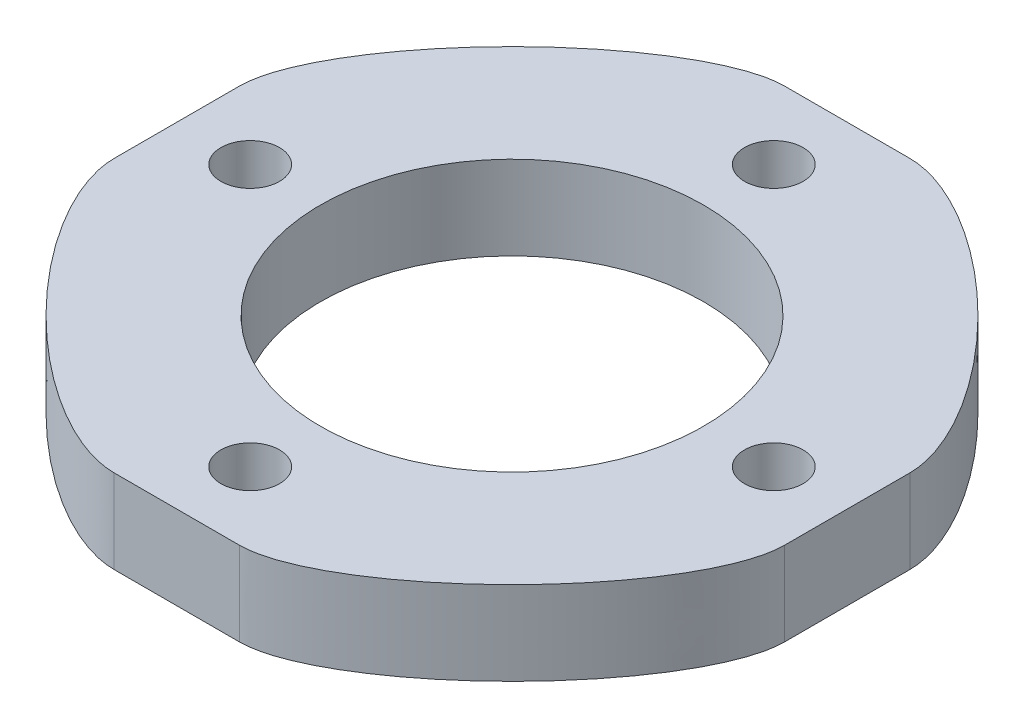
ISO-10303-21;
HEADER;
FILE_DESCRIPTION(('STEP AP214'),'2;1');
FILE_NAME('part.step','',(''),(''),'','','');
FILE_SCHEMA(('AUTOMOTIVE_DESIGN { 1 0 10303 214 1 1 1 1 }'));
ENDSEC;
DATA;
#1=APPLICATION_CONTEXT('core data for automotive mechanical design processes');
#2=APPLICATION_PROTOCOL_DEFINITION('international standard','automotive_design',2000,#1);
#3=PRODUCT_CONTEXT('',#1,'mechanical');
#4=PRODUCT('Part','Part','',(#3));
#5=PRODUCT_RELATED_PRODUCT_CATEGORY('part','',(#4));
#6=PRODUCT_DEFINITION_FORMATION('','',#4);
#7=PRODUCT_DEFINITION_CONTEXT('part definition',#1,'design');
#8=PRODUCT_DEFINITION('design','',#6,#7);
#9=PRODUCT_DEFINITION_SHAPE('','',#8);
#10=(LENGTH_UNIT() NAMED_UNIT(*) SI_UNIT(.MILLI.,.METRE.));
#11=(NAMED_UNIT(*) PLANE_ANGLE_UNIT() SI_UNIT($,.RADIAN.));
#12=(NAMED_UNIT(*) SI_UNIT($,.STERADIAN.) SOLID_ANGLE_UNIT());
#13=UNCERTAINTY_MEASURE_WITH_UNIT(LENGTH_MEASURE(1.E-05),#10,'distance_accuracy_value','');
#14=(GEOMETRIC_REPRESENTATION_CONTEXT(3) GLOBAL_UNCERTAINTY_ASSIGNED_CONTEXT((#13)) GLOBAL_UNIT_ASSIGNED_CONTEXT((#10,
#11,#12)) REPRESENTATION_CONTEXT('',''));
#15=CARTESIAN_POINT('',(0.,0.,0.));
#16=DIRECTION('',(0.,0.,1.));
#17=DIRECTION('',(1.,0.,0.));
#18=AXIS2_PLACEMENT_3D('',#15,#16,#17);
#19=CARTESIAN_POINT('',(0.,4.,0.));
#20=DIRECTION('',(1.,0.,0.));
#21=DIRECTION('',(0.,0.,-1.));
#22=AXIS2_PLACEMENT_3D('',#19,#20,#21);
#23=PLANE('',#22);
#24=DIRECTION('',(0.,0.,1.));
#25=VECTOR('',#24,1.);
#26=CARTESIAN_POINT('',(0.,4.,0.));
#27=LINE('',#26,#25);
#28=CARTESIAN_POINT('',(0.,4.,13.));
#29=VERTEX_POINT('',#28);
#30=CARTESIAN_POINT('',(0.,4.,19.));
#31=VERTEX_POINT('',#30);
#32=EDGE_CURVE('E137',#29,#31,#27,.T.);
#33=ORIENTED_EDGE('',*,*,#32,.F.);
#34=CARTESIAN_POINT('',(0.,-0.200000000000001,13.));
#35=CARTESIAN_POINT('',(0.,1.26666666666667,13.));
#36=CARTESIAN_POINT('',(0.,2.73333333333333,13.));
#37=CARTESIAN_POINT('',(0.,4.2,13.));
#38=(BOUNDED_CURVE() B_SPLINE_CURVE(3,(#34,#35,#36,#37),.UNSPECIFIED.,.F.,
.F.) B_SPLINE_CURVE_WITH_KNOTS((4,4),(-0.0002,0.0042),
.UNSPECIFIED.) CURVE() GEOMETRIC_REPRESENTATION_ITEM() RATIONAL_B_SPLINE_CURVE((1.,1.,1.,1.)) REPRESENTATION_ITEM(''));
#39=CARTESIAN_POINT('',(0.,0.,13.));
#40=VERTEX_POINT('',#39);
#41=EDGE_CURVE('E117',#29,#40,#38,.F.);
#42=ORIENTED_EDGE('',*,*,#41,.T.);
#43=DIRECTION('',(0.,0.,1.));
#44=VECTOR('',#43,1.);
#45=CARTESIAN_POINT('',(0.,0.,0.));
#46=LINE('',#45,#44);
#47=CARTESIAN_POINT('',(0.,0.,19.));
#48=VERTEX_POINT('',#47);
#49=EDGE_CURVE('E134',#40,#48,#46,.T.);
#50=ORIENTED_EDGE('',*,*,#49,.T.);
#51=CARTESIAN_POINT('',(0.,4.2,19.));
#52=CARTESIAN_POINT('',(0.,2.73333333333333,19.));
#53=CARTESIAN_POINT('',(0.,1.26666666666667,19.));
#54=CARTESIAN_POINT('',(0.,-0.200000000000001,19.));
#55=(BOUNDED_CURVE() B_SPLINE_CURVE(3,(#51,#52,#53,#54),.UNSPECIFIED.,.F.,
.F.) B_SPLINE_CURVE_WITH_KNOTS((4,4),(-0.0002,0.0042),
.UNSPECIFIED.) CURVE() GEOMETRIC_REPRESENTATION_ITEM() RATIONAL_B_SPLINE_CURVE((1.,1.,1.,1.)) REPRESENTATION_ITEM(''));
#56=EDGE_CURVE('E139',#48,#31,#55,.F.);
#57=ORIENTED_EDGE('',*,*,#56,.T.);
#58=EDGE_LOOP('',(#33,#42,#50,#57));
#59=FACE_BOUND('',#58,.T.);
#60=ADVANCED_FACE('F38',(#59),#23,.F.);
#61=CARTESIAN_POINT('',(0.,4.,32.));
#62=DIRECTION('',(0.,0.,-1.));
#63=DIRECTION('',(-1.,0.,0.));
#64=AXIS2_PLACEMENT_3D('',#61,#62,#63);
#65=PLANE('',#64);
#66=DIRECTION('',(1.,0.,0.));
#67=VECTOR('',#66,1.);
#68=CARTESIAN_POINT('',(0.,0.,32.));
#69=LINE('',#68,#67);
#70=CARTESIAN_POINT('',(13.,0.,32.));
#71=VERTEX_POINT('',#70);
#72=CARTESIAN_POINT('',(19.,0.,32.));
#73=VERTEX_POINT('',#72);
#74=EDGE_CURVE('E145',#71,#73,#69,.T.);
#75=ORIENTED_EDGE('',*,*,#74,.T.);
#76=CARTESIAN_POINT('',(19.,4.2,32.));
#77=CARTESIAN_POINT('',(19.,2.73333333333333,32.));
#78=CARTESIAN_POINT('',(19.,1.26666666666667,32.));
#79=CARTESIAN_POINT('',(19.,-0.200000000000001,32.));
#80=(BOUNDED_CURVE() B_SPLINE_CURVE(3,(#76,#77,#78,#79),.UNSPECIFIED.,.F.,
.F.) B_SPLINE_CURVE_WITH_KNOTS((4,4),(-0.0002,0.0042),
.UNSPECIFIED.) CURVE() GEOMETRIC_REPRESENTATION_ITEM() RATIONAL_B_SPLINE_CURVE((1.,1.,1.,1.)) REPRESENTATION_ITEM(''));
#81=CARTESIAN_POINT('',(19.,4.,32.));
#82=VERTEX_POINT('',#81);
#83=EDGE_CURVE('E12',#73,#82,#80,.F.);
#84=ORIENTED_EDGE('',*,*,#83,.T.);
#85=DIRECTION('',(1.,0.,0.));
#86=VECTOR('',#85,1.);
#87=CARTESIAN_POINT('',(0.,4.,32.));
#88=LINE('',#87,#86);
#89=CARTESIAN_POINT('',(13.,4.,32.));
#90=VERTEX_POINT('',#89);
#91=EDGE_CURVE('E237',#90,#82,#88,.T.);
#92=ORIENTED_EDGE('',*,*,#91,.F.);
#93=CARTESIAN_POINT('',(13.,-0.200000000000001,32.));
#94=CARTESIAN_POINT('',(13.,1.26666666666667,32.));
#95=CARTESIAN_POINT('',(13.,2.73333333333333,32.));
#96=CARTESIAN_POINT('',(13.,4.2,32.));
#97=(BOUNDED_CURVE() B_SPLINE_CURVE(3,(#93,#94,#95,#96),.UNSPECIFIED.,.F.,
.F.) B_SPLINE_CURVE_WITH_KNOTS((4,4),(-0.0002,0.0042),
.UNSPECIFIED.) CURVE() GEOMETRIC_REPRESENTATION_ITEM() RATIONAL_B_SPLINE_CURVE((1.,1.,1.,1.)) REPRESENTATION_ITEM(''));
#98=EDGE_CURVE('E52',#90,#71,#97,.F.);
#99=ORIENTED_EDGE('',*,*,#98,.T.);
#100=EDGE_LOOP('',(#75,#84,#92,#99));
#101=FACE_BOUND('',#100,.T.);
#102=ADVANCED_FACE('F305',(#101),#65,.F.);
#103=CARTESIAN_POINT('',(32.,4.,0.));
#104=DIRECTION('',(-1.,0.,0.));
#105=DIRECTION('',(0.,0.,1.));
#106=AXIS2_PLACEMENT_3D('',#103,#104,#105);
#107=PLANE('',#106);
#108=DIRECTION('',(0.,0.,-1.));
#109=VECTOR('',#108,1.);
#110=CARTESIAN_POINT('',(32.,0.,0.));
#111=LINE('',#110,#109);
#112=CARTESIAN_POINT('',(32.,0.,19.));
#113=VERTEX_POINT('',#112);
#114=CARTESIAN_POINT('',(32.,0.,13.));
#115=VERTEX_POINT('',#114);
#116=EDGE_CURVE('E149',#113,#115,#111,.T.);
#117=ORIENTED_EDGE('',*,*,#116,.T.);
#118=CARTESIAN_POINT('',(32.,4.2,13.));
#119=CARTESIAN_POINT('',(32.,2.73333333333333,13.));
#120=CARTESIAN_POINT('',(32.,1.26666666666667,13.));
#121=CARTESIAN_POINT('',(32.,-0.200000000000001,13.));
#122=(BOUNDED_CURVE() B_SPLINE_CURVE(3,(#118,#119,#120,#121),.UNSPECIFIED.,.F.,
.F.) B_SPLINE_CURVE_WITH_KNOTS((4,4),(-0.0002,0.0042),
.UNSPECIFIED.) CURVE() GEOMETRIC_REPRESENTATION_ITEM() RATIONAL_B_SPLINE_CURVE((1.,1.,1.,1.)) REPRESENTATION_ITEM(''));
#123=CARTESIAN_POINT('',(32.,4.,13.));
#124=VERTEX_POINT('',#123);
#125=EDGE_CURVE('E59',#115,#124,#122,.F.);
#126=ORIENTED_EDGE('',*,*,#125,.T.);
#127=DIRECTION('',(0.,0.,-1.));
#128=VECTOR('',#127,1.);
#129=CARTESIAN_POINT('',(32.,4.,0.));
#130=LINE('',#129,#128);
#131=CARTESIAN_POINT('',(32.,4.,19.));
#132=VERTEX_POINT('',#131);
#133=EDGE_CURVE('E219',#132,#124,#130,.T.);
#134=ORIENTED_EDGE('',*,*,#133,.F.);
#135=CARTESIAN_POINT('',(32.,-0.200000000000001,19.));
#136=CARTESIAN_POINT('',(32.,1.26666666666667,19.));
#137=CARTESIAN_POINT('',(32.,2.73333333333333,19.));
#138=CARTESIAN_POINT('',(32.,4.2,19.));
#139=(BOUNDED_CURVE() B_SPLINE_CURVE(3,(#135,#136,#137,#138),.UNSPECIFIED.,.F.,
.F.) B_SPLINE_CURVE_WITH_KNOTS((4,4),(-0.0002,0.0042),
.UNSPECIFIED.) CURVE() GEOMETRIC_REPRESENTATION_ITEM() RATIONAL_B_SPLINE_CURVE((1.,1.,1.,1.)) REPRESENTATION_ITEM(''));
#140=EDGE_CURVE('E335',#132,#113,#139,.F.);
#141=ORIENTED_EDGE('',*,*,#140,.T.);
#142=EDGE_LOOP('',(#117,#126,#134,#141));
#143=FACE_BOUND('',#142,.T.);
#144=ADVANCED_FACE('F310',(#143),#107,.F.);
#145=CARTESIAN_POINT('',(0.,4.,0.));
#146=DIRECTION('',(0.,0.,1.));
#147=DIRECTION('',(1.,0.,0.));
#148=AXIS2_PLACEMENT_3D('',#145,#146,#147);
#149=PLANE('',#148);
#150=DIRECTION('',(-1.,0.,0.));
#151=VECTOR('',#150,1.);
#152=CARTESIAN_POINT('',(0.,0.,0.));
#153=LINE('',#152,#151);
#154=CARTESIAN_POINT('',(19.,0.,0.));
#155=VERTEX_POINT('',#154);
#156=CARTESIAN_POINT('',(13.,0.,0.));
#157=VERTEX_POINT('',#156);
#158=EDGE_CURVE('E326',#155,#157,#153,.T.);
#159=ORIENTED_EDGE('',*,*,#158,.T.);
#160=CARTESIAN_POINT('',(13.,4.2,0.));
#161=CARTESIAN_POINT('',(13.,2.73333333333333,0.));
#162=CARTESIAN_POINT('',(13.,1.26666666666667,0.));
#163=CARTESIAN_POINT('',(13.,-0.200000000000001,0.));
#164=(BOUNDED_CURVE() B_SPLINE_CURVE(3,(#160,#161,#162,#163),.UNSPECIFIED.,.F.,
.F.) B_SPLINE_CURVE_WITH_KNOTS((4,4),(-0.0002,0.0042),
.UNSPECIFIED.) CURVE() GEOMETRIC_REPRESENTATION_ITEM() RATIONAL_B_SPLINE_CURVE((1.,1.,1.,1.)) REPRESENTATION_ITEM(''));
#165=CARTESIAN_POINT('',(13.,4.,0.));
#166=VERTEX_POINT('',#165);
#167=EDGE_CURVE('E119',#157,#166,#164,.F.);
#168=ORIENTED_EDGE('',*,*,#167,.T.);
#169=DIRECTION('',(-1.,0.,0.));
#170=VECTOR('',#169,1.);
#171=CARTESIAN_POINT('',(0.,4.,0.));
#172=LINE('',#171,#170);
#173=CARTESIAN_POINT('',(19.,4.,0.));
#174=VERTEX_POINT('',#173);
#175=EDGE_CURVE('E211',#174,#166,#172,.T.);
#176=ORIENTED_EDGE('',*,*,#175,.F.);
#177=CARTESIAN_POINT('',(19.,-0.200000000000001,0.));
#178=CARTESIAN_POINT('',(19.,1.26666666666667,0.));
#179=CARTESIAN_POINT('',(19.,2.73333333333333,0.));
#180=CARTESIAN_POINT('',(19.,4.2,0.));
#181=(BOUNDED_CURVE() B_SPLINE_CURVE(3,(#177,#178,#179,#180),.UNSPECIFIED.,.F.,
.F.) B_SPLINE_CURVE_WITH_KNOTS((4,4),(-0.0002,0.0042),
.UNSPECIFIED.) CURVE() GEOMETRIC_REPRESENTATION_ITEM() RATIONAL_B_SPLINE_CURVE((1.,1.,1.,1.)) REPRESENTATION_ITEM(''));
#182=EDGE_CURVE('E126',#174,#155,#181,.F.);
#183=ORIENTED_EDGE('',*,*,#182,.T.);
#184=EDGE_LOOP('',(#159,#168,#176,#183));
#185=FACE_BOUND('',#184,.T.);
#186=ADVANCED_FACE('F190',(#185),#149,.F.);
#187=CARTESIAN_POINT('',(0.,4.,0.));
#188=DIRECTION('',(0.,1.,0.));
#189=DIRECTION('',(0.,0.,1.));
#190=AXIS2_PLACEMENT_3D('',#187,#188,#189);
#191=PLANE('',#190);
#192=CARTESIAN_POINT('',(3.5,4.,16.));
#193=DIRECTION('',(0.,-1.,0.));
#194=DIRECTION('',(0.,0.,-1.));
#195=AXIS2_PLACEMENT_3D('',#192,#193,#194);
#196=CIRCLE('',#195,1.4);
#197=CARTESIAN_POINT('',(3.5,4.,14.6));
#198=VERTEX_POINT('',#197);
#199=EDGE_CURVE('E268',#198,#198,#196,.T.);
#200=ORIENTED_EDGE('',*,*,#199,.T.);
#201=EDGE_LOOP('',(#200));
#202=FACE_BOUND('',#201,.T.);
#203=CARTESIAN_POINT('',(16.,4.,3.5));
#204=DIRECTION('',(0.,-1.,0.));
#205=DIRECTION('',(0.,0.,-1.));
#206=AXIS2_PLACEMENT_3D('',#203,#204,#205);
#207=CIRCLE('',#206,1.4);
#208=CARTESIAN_POINT('',(16.,4.,2.1));
#209=VERTEX_POINT('',#208);
#210=EDGE_CURVE('E257',#209,#209,#207,.T.);
#211=ORIENTED_EDGE('',*,*,#210,.T.);
#212=EDGE_LOOP('',(#211));
#213=FACE_BOUND('',#212,.T.);
#214=CARTESIAN_POINT('',(28.5,4.,16.));
#215=DIRECTION('',(0.,-1.,0.));
#216=DIRECTION('',(0.,0.,-1.));
#217=AXIS2_PLACEMENT_3D('',#214,#215,#216);
#218=CIRCLE('',#217,1.4);
#219=CARTESIAN_POINT('',(28.5,4.,14.6));
#220=VERTEX_POINT('',#219);
#221=EDGE_CURVE('E256',#220,#220,#218,.T.);
#222=ORIENTED_EDGE('',*,*,#221,.T.);
#223=EDGE_LOOP('',(#222));
#224=FACE_BOUND('',#223,.T.);
#225=CARTESIAN_POINT('',(16.,4.,28.5));
#226=DIRECTION('',(0.,-1.,0.));
#227=DIRECTION('',(0.,0.,-1.));
#228=AXIS2_PLACEMENT_3D('',#225,#226,#227);
#229=CIRCLE('',#228,1.4);
#230=CARTESIAN_POINT('',(16.,4.,27.1));
#231=VERTEX_POINT('',#230);
#232=EDGE_CURVE('E251',#231,#231,#229,.T.);
#233=ORIENTED_EDGE('',*,*,#232,.T.);
#234=EDGE_LOOP('',(#233));
#235=FACE_BOUND('',#234,.T.);
#236=CARTESIAN_POINT('',(16.,4.,16.));
#237=DIRECTION('',(0.,-1.,0.));
#238=DIRECTION('',(0.,0.,-1.));
#239=AXIS2_PLACEMENT_3D('',#236,#237,#238);
#240=CIRCLE('',#239,9.15);
#241=CARTESIAN_POINT('',(16.,4.,6.85));
#242=VERTEX_POINT('',#241);
#243=EDGE_CURVE('E146',#242,#242,#240,.T.);
#244=ORIENTED_EDGE('',*,*,#243,.T.);
#245=EDGE_LOOP('',(#244));
#246=FACE_BOUND('',#245,.T.);
#247=ORIENTED_EDGE('',*,*,#175,.T.);
#248=CARTESIAN_POINT('',(0.,4.,13.));
#249=CARTESIAN_POINT('',(0.,4.,0.));
#250=CARTESIAN_POINT('',(13.,4.,0.));
#251=(BOUNDED_CURVE() B_SPLINE_CURVE(2,(#248,#249,#250),.UNSPECIFIED.,.F.,
.F.) B_SPLINE_CURVE_WITH_KNOTS((3,3),(0.,1.),
.UNSPECIFIED.) CURVE() GEOMETRIC_REPRESENTATION_ITEM() RATIONAL_B_SPLINE_CURVE((1.,
0.333333333333333,1.)) REPRESENTATION_ITEM(''));
#252=EDGE_CURVE('E392',#166,#29,#251,.F.);
#253=ORIENTED_EDGE('',*,*,#252,.T.);
#254=ORIENTED_EDGE('',*,*,#32,.T.);
#255=CARTESIAN_POINT('',(13.,4.,32.));
#256=CARTESIAN_POINT('',(0.,4.,32.));
#257=CARTESIAN_POINT('',(0.,4.,19.));
#258=(BOUNDED_CURVE() B_SPLINE_CURVE(2,(#255,#256,#257),.UNSPECIFIED.,.F.,
.F.) B_SPLINE_CURVE_WITH_KNOTS((3,3),(0.,1.),
.UNSPECIFIED.) CURVE() GEOMETRIC_REPRESENTATION_ITEM() RATIONAL_B_SPLINE_CURVE((1.,
0.333333333333333,1.)) REPRESENTATION_ITEM(''));
#259=EDGE_CURVE('E389',#31,#90,#258,.F.);
#260=ORIENTED_EDGE('',*,*,#259,.T.);
#261=ORIENTED_EDGE('',*,*,#91,.T.);
#262=CARTESIAN_POINT('',(32.,4.,19.));
#263=CARTESIAN_POINT('',(32.,4.,32.));
#264=CARTESIAN_POINT('',(19.,4.,32.));
#265=(BOUNDED_CURVE() B_SPLINE_CURVE(2,(#262,#263,#264),.UNSPECIFIED.,.F.,
.F.) B_SPLINE_CURVE_WITH_KNOTS((3,3),(0.,1.),
.UNSPECIFIED.) CURVE() GEOMETRIC_REPRESENTATION_ITEM() RATIONAL_B_SPLINE_CURVE((1.,
0.333333333333333,1.)) REPRESENTATION_ITEM(''));
#266=EDGE_CURVE('E67',#82,#132,#265,.F.);
#267=ORIENTED_EDGE('',*,*,#266,.T.);
#268=ORIENTED_EDGE('',*,*,#133,.T.);
#269=CARTESIAN_POINT('',(19.,4.,0.));
#270=CARTESIAN_POINT('',(32.,4.,0.));
#271=CARTESIAN_POINT('',(32.,4.,13.));
#272=(BOUNDED_CURVE() B_SPLINE_CURVE(2,(#269,#270,#271),.UNSPECIFIED.,.F.,
.F.) B_SPLINE_CURVE_WITH_KNOTS((3,3),(0.,1.),
.UNSPECIFIED.) CURVE() GEOMETRIC_REPRESENTATION_ITEM() RATIONAL_B_SPLINE_CURVE((1.,
0.333333333333333,1.)) REPRESENTATION_ITEM(''));
#273=EDGE_CURVE('E342',#124,#174,#272,.F.);
#274=ORIENTED_EDGE('',*,*,#273,.T.);
#275=EDGE_LOOP('',(#247,#253,#254,#260,#261,#267,#268,#274));
#276=FACE_BOUND('',#275,.T.);
#277=ADVANCED_FACE('F186',(#202,#213,#224,#235,#246,#276),#191,.T.);
#278=CARTESIAN_POINT('',(0.,0.,0.));
#279=DIRECTION('',(0.,1.,0.));
#280=DIRECTION('',(0.,0.,1.));
#281=AXIS2_PLACEMENT_3D('',#278,#279,#280);
#282=PLANE('',#281);
#283=CARTESIAN_POINT('',(3.5,0.,16.));
#284=DIRECTION('',(0.,-1.,0.));
#285=DIRECTION('',(0.,0.,-1.));
#286=AXIS2_PLACEMENT_3D('',#283,#284,#285);
#287=CIRCLE('',#286,1.4);
#288=CARTESIAN_POINT('',(3.5,0.,14.6));
#289=VERTEX_POINT('',#288);
#290=EDGE_CURVE('E265',#289,#289,#287,.T.);
#291=ORIENTED_EDGE('',*,*,#290,.F.);
#292=EDGE_LOOP('',(#291));
#293=FACE_BOUND('',#292,.T.);
#294=CARTESIAN_POINT('',(16.,0.,3.5));
#295=DIRECTION('',(0.,-1.,0.));
#296=DIRECTION('',(0.,0.,-1.));
#297=AXIS2_PLACEMENT_3D('',#294,#295,#296);
#298=CIRCLE('',#297,1.4);
#299=CARTESIAN_POINT('',(16.,0.,2.1));
#300=VERTEX_POINT('',#299);
#301=EDGE_CURVE('E271',#300,#300,#298,.T.);
#302=ORIENTED_EDGE('',*,*,#301,.F.);
#303=EDGE_LOOP('',(#302));
#304=FACE_BOUND('',#303,.T.);
#305=CARTESIAN_POINT('',(28.5,0.,16.));
#306=DIRECTION('',(0.,-1.,0.));
#307=DIRECTION('',(0.,0.,-1.));
#308=AXIS2_PLACEMENT_3D('',#305,#306,#307);
#309=CIRCLE('',#308,1.4);
#310=CARTESIAN_POINT('',(28.5,0.,14.6));
#311=VERTEX_POINT('',#310);
#312=EDGE_CURVE('E253',#311,#311,#309,.T.);
#313=ORIENTED_EDGE('',*,*,#312,.F.);
#314=EDGE_LOOP('',(#313));
#315=FACE_BOUND('',#314,.T.);
#316=CARTESIAN_POINT('',(16.,0.,28.5));
#317=DIRECTION('',(0.,-1.,0.));
#318=DIRECTION('',(0.,0.,-1.));
#319=AXIS2_PLACEMENT_3D('',#316,#317,#318);
#320=CIRCLE('',#319,1.4);
#321=CARTESIAN_POINT('',(16.,0.,27.1));
#322=VERTEX_POINT('',#321);
#323=EDGE_CURVE('E260',#322,#322,#320,.T.);
#324=ORIENTED_EDGE('',*,*,#323,.F.);
#325=EDGE_LOOP('',(#324));
#326=FACE_BOUND('',#325,.T.);
#327=CARTESIAN_POINT('',(16.,0.,16.));
#328=DIRECTION('',(0.,-1.,0.));
#329=DIRECTION('',(0.,0.,-1.));
#330=AXIS2_PLACEMENT_3D('',#327,#328,#329);
#331=CIRCLE('',#330,9.15);
#332=CARTESIAN_POINT('',(16.,0.,6.85));
#333=VERTEX_POINT('',#332);
#334=EDGE_CURVE('E152',#333,#333,#331,.T.);
#335=ORIENTED_EDGE('',*,*,#334,.F.);
#336=EDGE_LOOP('',(#335));
#337=FACE_BOUND('',#336,.T.);
#338=ORIENTED_EDGE('',*,*,#49,.F.);
#339=CARTESIAN_POINT('',(13.,0.,0.));
#340=CARTESIAN_POINT('',(0.,0.,0.));
#341=CARTESIAN_POINT('',(0.,0.,13.));
#342=(BOUNDED_CURVE() B_SPLINE_CURVE(2,(#339,#340,#341),.UNSPECIFIED.,.F.,
.F.) B_SPLINE_CURVE_WITH_KNOTS((3,3),(0.,1.),
.UNSPECIFIED.) CURVE() GEOMETRIC_REPRESENTATION_ITEM() RATIONAL_B_SPLINE_CURVE((1.,
0.333333333333333,1.)) REPRESENTATION_ITEM(''));
#343=EDGE_CURVE('E112',#40,#157,#342,.F.);
#344=ORIENTED_EDGE('',*,*,#343,.T.);
#345=ORIENTED_EDGE('',*,*,#158,.F.);
#346=CARTESIAN_POINT('',(32.,0.,13.));
#347=CARTESIAN_POINT('',(32.,0.,0.));
#348=CARTESIAN_POINT('',(19.,0.,0.));
#349=(BOUNDED_CURVE() B_SPLINE_CURVE(2,(#346,#347,#348),.UNSPECIFIED.,.F.,
.F.) B_SPLINE_CURVE_WITH_KNOTS((3,3),(0.,1.),
.UNSPECIFIED.) CURVE() GEOMETRIC_REPRESENTATION_ITEM() RATIONAL_B_SPLINE_CURVE((1.,
0.333333333333333,1.)) REPRESENTATION_ITEM(''));
#350=EDGE_CURVE('E127',#155,#115,#349,.F.);
#351=ORIENTED_EDGE('',*,*,#350,.T.);
#352=ORIENTED_EDGE('',*,*,#116,.F.);
#353=CARTESIAN_POINT('',(19.,0.,32.));
#354=CARTESIAN_POINT('',(32.,0.,32.));
#355=CARTESIAN_POINT('',(32.,0.,19.));
#356=(BOUNDED_CURVE() B_SPLINE_CURVE(2,(#353,#354,#355),.UNSPECIFIED.,.F.,
.F.) B_SPLINE_CURVE_WITH_KNOTS((3,3),(0.,1.),
.UNSPECIFIED.) CURVE() GEOMETRIC_REPRESENTATION_ITEM() RATIONAL_B_SPLINE_CURVE((1.,
0.333333333333333,1.)) REPRESENTATION_ITEM(''));
#357=EDGE_CURVE('E603',#113,#73,#356,.F.);
#358=ORIENTED_EDGE('',*,*,#357,.T.);
#359=ORIENTED_EDGE('',*,*,#74,.F.);
#360=CARTESIAN_POINT('',(0.,0.,19.));
#361=CARTESIAN_POINT('',(0.,0.,32.));
#362=CARTESIAN_POINT('',(13.,0.,32.));
#363=(BOUNDED_CURVE() B_SPLINE_CURVE(2,(#360,#361,#362),.UNSPECIFIED.,.F.,
.F.) B_SPLINE_CURVE_WITH_KNOTS((3,3),(0.,1.),
.UNSPECIFIED.) CURVE() GEOMETRIC_REPRESENTATION_ITEM() RATIONAL_B_SPLINE_CURVE((1.,
0.333333333333333,1.)) REPRESENTATION_ITEM(''));
#364=EDGE_CURVE('E138',#71,#48,#363,.F.);
#365=ORIENTED_EDGE('',*,*,#364,.T.);
#366=EDGE_LOOP('',(#338,#344,#345,#351,#352,#358,#359,#365));
#367=FACE_BOUND('',#366,.T.);
#368=ADVANCED_FACE('F142',(#293,#304,#315,#326,#337,#367),#282,.F.);
#369=CARTESIAN_POINT('',(16.,4.,16.));
#370=DIRECTION('',(0.,-1.,0.));
#371=DIRECTION('',(0.,0.,-1.));
#372=AXIS2_PLACEMENT_3D('',#369,#370,#371);
#373=CYLINDRICAL_SURFACE('',#372,9.15);
#374=ORIENTED_EDGE('',*,*,#243,.F.);
#375=EDGE_LOOP('',(#374));
#376=FACE_BOUND('',#375,.T.);
#377=ORIENTED_EDGE('',*,*,#334,.T.);
#378=EDGE_LOOP('',(#377));
#379=FACE_BOUND('',#378,.T.);
#380=ADVANCED_FACE('F185',(#376,#379),#373,.F.);
#381=CARTESIAN_POINT('',(16.,4.,28.5));
#382=DIRECTION('',(0.,-1.,0.));
#383=DIRECTION('',(0.,0.,-1.));
#384=AXIS2_PLACEMENT_3D('',#381,#382,#383);
#385=CYLINDRICAL_SURFACE('',#384,1.4);
#386=ORIENTED_EDGE('',*,*,#232,.F.);
#387=EDGE_LOOP('',(#386));
#388=FACE_BOUND('',#387,.T.);
#389=ORIENTED_EDGE('',*,*,#323,.T.);
#390=EDGE_LOOP('',(#389));
#391=FACE_BOUND('',#390,.T.);
#392=ADVANCED_FACE('F295',(#388,#391),#385,.F.);
#393=CARTESIAN_POINT('',(28.5,4.,16.));
#394=DIRECTION('',(0.,-1.,0.));
#395=DIRECTION('',(0.,0.,-1.));
#396=AXIS2_PLACEMENT_3D('',#393,#394,#395);
#397=CYLINDRICAL_SURFACE('',#396,1.4);
#398=ORIENTED_EDGE('',*,*,#221,.F.);
#399=EDGE_LOOP('',(#398));
#400=FACE_BOUND('',#399,.T.);
#401=ORIENTED_EDGE('',*,*,#312,.T.);
#402=EDGE_LOOP('',(#401));
#403=FACE_BOUND('',#402,.T.);
#404=ADVANCED_FACE('F283',(#400,#403),#397,.F.);
#405=CARTESIAN_POINT('',(16.,4.,3.5));
#406=DIRECTION('',(0.,-1.,0.));
#407=DIRECTION('',(0.,0.,-1.));
#408=AXIS2_PLACEMENT_3D('',#405,#406,#407);
#409=CYLINDRICAL_SURFACE('',#408,1.4);
#410=ORIENTED_EDGE('',*,*,#210,.F.);
#411=EDGE_LOOP('',(#410));
#412=FACE_BOUND('',#411,.T.);
#413=ORIENTED_EDGE('',*,*,#301,.T.);
#414=EDGE_LOOP('',(#413));
#415=FACE_BOUND('',#414,.T.);
#416=ADVANCED_FACE('F279',(#412,#415),#409,.F.);
#417=CARTESIAN_POINT('',(3.5,4.,16.));
#418=DIRECTION('',(0.,-1.,0.));
#419=DIRECTION('',(0.,0.,-1.));
#420=AXIS2_PLACEMENT_3D('',#417,#418,#419);
#421=CYLINDRICAL_SURFACE('',#420,1.4);
#422=ORIENTED_EDGE('',*,*,#199,.F.);
#423=EDGE_LOOP('',(#422));
#424=FACE_BOUND('',#423,.T.);
#425=ORIENTED_EDGE('',*,*,#290,.T.);
#426=EDGE_LOOP('',(#425));
#427=FACE_BOUND('',#426,.T.);
#428=ADVANCED_FACE('F282',(#424,#427),#421,.F.);
#429=CARTESIAN_POINT('',(0.,4.2,13.));
#430=CARTESIAN_POINT('',(0.,2.73333333333333,13.));
#431=CARTESIAN_POINT('',(0.,1.26666666666667,13.));
#432=CARTESIAN_POINT('',(0.,-0.200000000000001,13.));
#433=CARTESIAN_POINT('',(0.,4.2,0.));
#434=CARTESIAN_POINT('',(0.,2.73333333333333,0.));
#435=CARTESIAN_POINT('',(0.,1.26666666666667,0.));
#436=CARTESIAN_POINT('',(0.,-0.200000000000001,0.));
#437=CARTESIAN_POINT('',(13.,4.2,0.));
#438=CARTESIAN_POINT('',(13.,2.73333333333333,0.));
#439=CARTESIAN_POINT('',(13.,1.26666666666667,0.));
#440=CARTESIAN_POINT('',(13.,-0.200000000000001,0.));
#441=(BOUNDED_SURFACE() B_SPLINE_SURFACE(2,3,((#429,#430,#431,#432),(#433,#434,#435,#436),(#437,
#438,#439,#440)),.UNSPECIFIED.,.F.,.F.,.F.) B_SPLINE_SURFACE_WITH_KNOTS((3,3),(4,4),(0.,1.),
(-0.0002,0.0042),.UNSPECIFIED.) GEOMETRIC_REPRESENTATION_ITEM() RATIONAL_B_SPLINE_SURFACE(((1.,
1.,1.,1.),(0.333333333333333,0.333333333333333,0.333333333333333,0.333333333333333),(1.,1.,1.,1.))) REPRESENTATION_ITEM('') SURFACE());
#442=ORIENTED_EDGE('',*,*,#252,.F.);
#443=ORIENTED_EDGE('',*,*,#167,.F.);
#444=ORIENTED_EDGE('',*,*,#343,.F.);
#445=ORIENTED_EDGE('',*,*,#41,.F.);
#446=EDGE_LOOP('',(#442,#443,#444,#445));
#447=FACE_BOUND('',#446,.T.);
#448=ADVANCED_FACE('F116',(#447),#441,.T.);
#449=CARTESIAN_POINT('',(19.,4.2,0.));
#450=CARTESIAN_POINT('',(19.,2.73333333333333,0.));
#451=CARTESIAN_POINT('',(19.,1.26666666666667,0.));
#452=CARTESIAN_POINT('',(19.,-0.200000000000001,0.));
#453=CARTESIAN_POINT('',(32.,4.2,0.));
#454=CARTESIAN_POINT('',(32.,2.73333333333333,0.));
#455=CARTESIAN_POINT('',(32.,1.26666666666667,0.));
#456=CARTESIAN_POINT('',(32.,-0.200000000000001,0.));
#457=CARTESIAN_POINT('',(32.,4.2,13.));
#458=CARTESIAN_POINT('',(32.,2.73333333333333,13.));
#459=CARTESIAN_POINT('',(32.,1.26666666666667,13.));
#460=CARTESIAN_POINT('',(32.,-0.200000000000001,13.));
#461=(BOUNDED_SURFACE() B_SPLINE_SURFACE(2,3,((#449,#450,#451,#452),(#453,#454,#455,#456),(#457,
#458,#459,#460)),.UNSPECIFIED.,.F.,.F.,.F.) B_SPLINE_SURFACE_WITH_KNOTS((3,3),(4,4),(0.,1.),
(-0.0002,0.0042),.UNSPECIFIED.) GEOMETRIC_REPRESENTATION_ITEM() RATIONAL_B_SPLINE_SURFACE(((1.,
1.,1.,1.),(0.333333333333333,0.333333333333333,0.333333333333333,0.333333333333333),(1.,1.,1.,1.))) REPRESENTATION_ITEM('') SURFACE());
#462=ORIENTED_EDGE('',*,*,#273,.F.);
#463=ORIENTED_EDGE('',*,*,#125,.F.);
#464=ORIENTED_EDGE('',*,*,#350,.F.);
#465=ORIENTED_EDGE('',*,*,#182,.F.);
#466=EDGE_LOOP('',(#462,#463,#464,#465));
#467=FACE_BOUND('',#466,.T.);
#468=ADVANCED_FACE('F340',(#467),#461,.T.);
#469=CARTESIAN_POINT('',(32.,4.2,19.));
#470=CARTESIAN_POINT('',(32.,2.73333333333333,19.));
#471=CARTESIAN_POINT('',(32.,1.26666666666667,19.));
#472=CARTESIAN_POINT('',(32.,-0.200000000000001,19.));
#473=CARTESIAN_POINT('',(32.,4.2,32.));
#474=CARTESIAN_POINT('',(32.,2.73333333333333,32.));
#475=CARTESIAN_POINT('',(32.,1.26666666666667,32.));
#476=CARTESIAN_POINT('',(32.,-0.200000000000001,32.));
#477=CARTESIAN_POINT('',(19.,4.2,32.));
#478=CARTESIAN_POINT('',(19.,2.73333333333333,32.));
#479=CARTESIAN_POINT('',(19.,1.26666666666667,32.));
#480=CARTESIAN_POINT('',(19.,-0.200000000000001,32.));
#481=(BOUNDED_SURFACE() B_SPLINE_SURFACE(2,3,((#469,#470,#471,#472),(#473,#474,#475,#476),(#477,
#478,#479,#480)),.UNSPECIFIED.,.F.,.F.,.F.) B_SPLINE_SURFACE_WITH_KNOTS((3,3),(4,4),(0.,1.),
(-0.0002,0.0042),.UNSPECIFIED.) GEOMETRIC_REPRESENTATION_ITEM() RATIONAL_B_SPLINE_SURFACE(((1.,
1.,1.,1.),(0.333333333333333,0.333333333333333,0.333333333333333,0.333333333333333),(1.,1.,1.,1.))) REPRESENTATION_ITEM('') SURFACE());
#482=ORIENTED_EDGE('',*,*,#266,.F.);
#483=ORIENTED_EDGE('',*,*,#83,.F.);
#484=ORIENTED_EDGE('',*,*,#357,.F.);
#485=ORIENTED_EDGE('',*,*,#140,.F.);
#486=EDGE_LOOP('',(#482,#483,#484,#485));
#487=FACE_BOUND('',#486,.T.);
#488=ADVANCED_FACE('F365',(#487),#481,.T.);
#489=CARTESIAN_POINT('',(13.,4.2,32.));
#490=CARTESIAN_POINT('',(13.,2.73333333333333,32.));
#491=CARTESIAN_POINT('',(13.,1.26666666666667,32.));
#492=CARTESIAN_POINT('',(13.,-0.200000000000001,32.));
#493=CARTESIAN_POINT('',(0.,4.2,32.));
#494=CARTESIAN_POINT('',(0.,2.73333333333333,32.));
#495=CARTESIAN_POINT('',(0.,1.26666666666667,32.));
#496=CARTESIAN_POINT('',(0.,-0.200000000000001,32.));
#497=CARTESIAN_POINT('',(0.,4.2,19.));
#498=CARTESIAN_POINT('',(0.,2.73333333333333,19.));
#499=CARTESIAN_POINT('',(0.,1.26666666666667,19.));
#500=CARTESIAN_POINT('',(0.,-0.200000000000001,19.));
#501=(BOUNDED_SURFACE() B_SPLINE_SURFACE(2,3,((#489,#490,#491,#492),(#493,#494,#495,#496),(#497,
#498,#499,#500)),.UNSPECIFIED.,.F.,.F.,.F.) B_SPLINE_SURFACE_WITH_KNOTS((3,3),(4,4),(0.,1.),
(-0.0002,0.0042),.UNSPECIFIED.) GEOMETRIC_REPRESENTATION_ITEM() RATIONAL_B_SPLINE_SURFACE(((1.,
1.,1.,1.),(0.333333333333333,0.333333333333333,0.333333333333333,0.333333333333333),(1.,1.,1.,1.))) REPRESENTATION_ITEM('') SURFACE());
#502=ORIENTED_EDGE('',*,*,#259,.F.);
#503=ORIENTED_EDGE('',*,*,#56,.F.);
#504=ORIENTED_EDGE('',*,*,#364,.F.);
#505=ORIENTED_EDGE('',*,*,#98,.F.);
#506=EDGE_LOOP('',(#502,#503,#504,#505));
#507=FACE_BOUND('',#506,.T.);
#508=ADVANCED_FACE('F41',(#507),#501,.T.);
#509=CLOSED_SHELL('',(#60,#102,#144,#186,#277,#368,#380,#392,#404,#416,#428,#448,#468,#488,#508));
#510=MANIFOLD_SOLID_BREP('B2',#509);
#511=ADVANCED_BREP_SHAPE_REPRESENTATION('',(#18,#510),#14);
#512=SHAPE_DEFINITION_REPRESENTATION(#9,#511);
ENDSEC;
END-ISO-10303-21;
